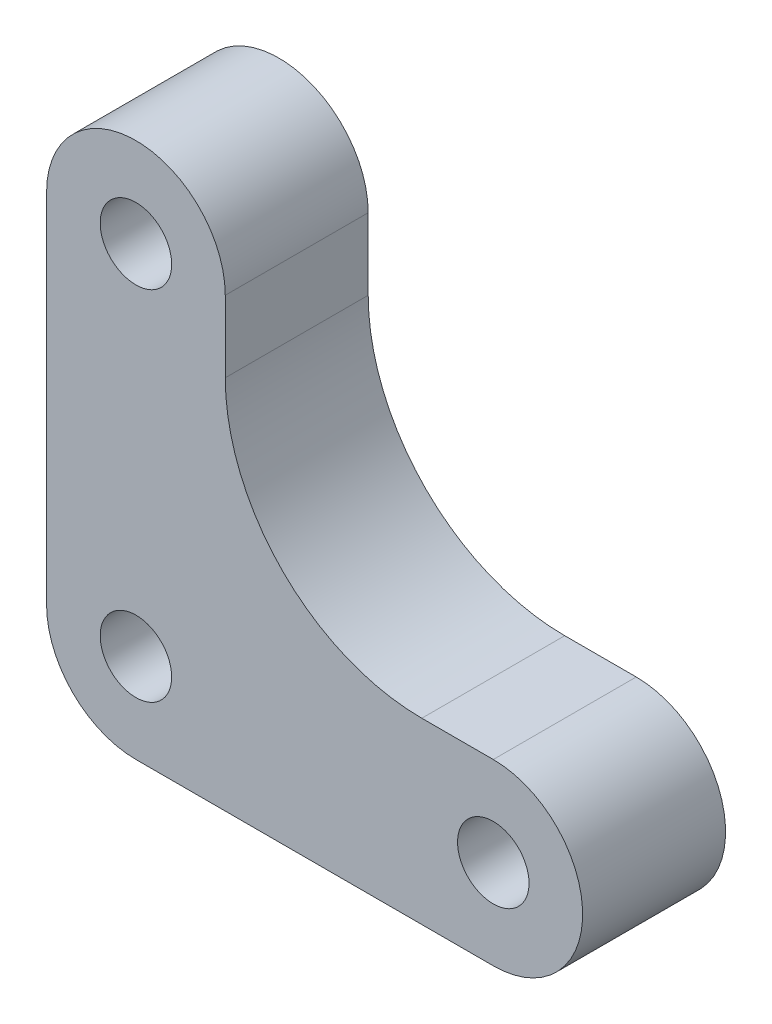
ISO-10303-21;
HEADER;
FILE_DESCRIPTION(('STEP AP214'),'2;1');
FILE_NAME('part.step','',(''),(''),'','','');
FILE_SCHEMA(('AUTOMOTIVE_DESIGN { 1 0 10303 214 1 1 1 1 }'));
ENDSEC;
DATA;
#1=APPLICATION_CONTEXT('core data for automotive mechanical design processes');
#2=APPLICATION_PROTOCOL_DEFINITION('international standard','automotive_design',2000,#1);
#3=PRODUCT_CONTEXT('',#1,'mechanical');
#4=PRODUCT('Part','Part','',(#3));
#5=PRODUCT_RELATED_PRODUCT_CATEGORY('part','',(#4));
#6=PRODUCT_DEFINITION_FORMATION('','',#4);
#7=PRODUCT_DEFINITION_CONTEXT('part definition',#1,'design');
#8=PRODUCT_DEFINITION('design','',#6,#7);
#9=PRODUCT_DEFINITION_SHAPE('','',#8);
#10=(LENGTH_UNIT() NAMED_UNIT(*) SI_UNIT(.MILLI.,.METRE.));
#11=(NAMED_UNIT(*) PLANE_ANGLE_UNIT() SI_UNIT($,.RADIAN.));
#12=(NAMED_UNIT(*) SI_UNIT($,.STERADIAN.) SOLID_ANGLE_UNIT());
#13=UNCERTAINTY_MEASURE_WITH_UNIT(LENGTH_MEASURE(1.E-05),#10,'distance_accuracy_value','');
#14=(GEOMETRIC_REPRESENTATION_CONTEXT(3) GLOBAL_UNCERTAINTY_ASSIGNED_CONTEXT((#13)) GLOBAL_UNIT_ASSIGNED_CONTEXT((#10,
#11,#12)) REPRESENTATION_CONTEXT('',''));
#15=CARTESIAN_POINT('',(0.,0.,0.));
#16=DIRECTION('',(0.,0.,1.));
#17=DIRECTION('',(1.,0.,0.));
#18=AXIS2_PLACEMENT_3D('',#15,#16,#17);
#19=CARTESIAN_POINT('',(-20.,20.,-5.));
#20=DIRECTION('',(0.,0.,-1.));
#21=DIRECTION('',(-1.,0.,0.));
#22=AXIS2_PLACEMENT_3D('',#19,#20,#21);
#23=CYLINDRICAL_SURFACE('',#22,5.);
#24=CARTESIAN_POINT('',(-20.,20.,-13.));
#25=DIRECTION('',(0.,0.,-1.));
#26=DIRECTION('',(-1.,0.,0.));
#27=AXIS2_PLACEMENT_3D('',#24,#25,#26);
#28=CIRCLE('',#27,5.);
#29=CARTESIAN_POINT('',(-25.,20.,-13.));
#30=VERTEX_POINT('',#29);
#31=CARTESIAN_POINT('',(-15.,20.,-13.));
#32=VERTEX_POINT('',#31);
#33=EDGE_CURVE('E205',#30,#32,#28,.T.);
#34=ORIENTED_EDGE('',*,*,#33,.F.);
#35=DIRECTION('',(0.,0.,-1.));
#36=VECTOR('',#35,1.);
#37=CARTESIAN_POINT('',(-25.,20.,-5.));
#38=LINE('',#37,#36);
#39=CARTESIAN_POINT('',(-25.,20.,-5.));
#40=VERTEX_POINT('',#39);
#41=EDGE_CURVE('E242',#40,#30,#38,.T.);
#42=ORIENTED_EDGE('',*,*,#41,.F.);
#43=CARTESIAN_POINT('',(-20.,20.,-5.));
#44=DIRECTION('',(0.,0.,-1.));
#45=DIRECTION('',(-1.,0.,0.));
#46=AXIS2_PLACEMENT_3D('',#43,#44,#45);
#47=CIRCLE('',#46,5.);
#48=CARTESIAN_POINT('',(-15.,20.,-5.));
#49=VERTEX_POINT('',#48);
#50=EDGE_CURVE('E210',#40,#49,#47,.T.);
#51=ORIENTED_EDGE('',*,*,#50,.T.);
#52=DIRECTION('',(0.,0.,-1.));
#53=VECTOR('',#52,1.);
#54=CARTESIAN_POINT('',(-15.,20.,-5.));
#55=LINE('',#54,#53);
#56=EDGE_CURVE('E227',#49,#32,#55,.T.);
#57=ORIENTED_EDGE('',*,*,#56,.T.);
#58=EDGE_LOOP('',(#34,#42,#51,#57));
#59=FACE_BOUND('',#58,.T.);
#60=ADVANCED_FACE('F39',(#59),#23,.T.);
#61=CARTESIAN_POINT('',(-25.,-5.,-5.));
#62=DIRECTION('',(-1.,0.,0.));
#63=DIRECTION('',(0.,0.,1.));
#64=AXIS2_PLACEMENT_3D('',#61,#62,#63);
#65=PLANE('',#64);
#66=DIRECTION('',(0.,1.,0.));
#67=VECTOR('',#66,1.);
#68=CARTESIAN_POINT('',(-25.,-5.,-13.));
#69=LINE('',#68,#67);
#70=CARTESIAN_POINT('',(-25.,0.,-13.));
#71=VERTEX_POINT('',#70);
#72=EDGE_CURVE('E214',#71,#30,#69,.T.);
#73=ORIENTED_EDGE('',*,*,#72,.F.);
#74=DIRECTION('',(0.,0.,-1.));
#75=VECTOR('',#74,1.);
#76=CARTESIAN_POINT('',(-25.,0.,-5.));
#77=LINE('',#76,#75);
#78=CARTESIAN_POINT('',(-25.,0.,-5.));
#79=VERTEX_POINT('',#78);
#80=EDGE_CURVE('E274',#71,#79,#77,.F.);
#81=ORIENTED_EDGE('',*,*,#80,.T.);
#82=DIRECTION('',(0.,1.,0.));
#83=VECTOR('',#82,1.);
#84=CARTESIAN_POINT('',(-25.,-5.,-5.));
#85=LINE('',#84,#83);
#86=EDGE_CURVE('E225',#79,#40,#85,.T.);
#87=ORIENTED_EDGE('',*,*,#86,.T.);
#88=ORIENTED_EDGE('',*,*,#41,.T.);
#89=EDGE_LOOP('',(#73,#81,#87,#88));
#90=FACE_BOUND('',#89,.T.);
#91=ADVANCED_FACE('F318',(#90),#65,.T.);
#92=CARTESIAN_POINT('',(0.,-5.,-5.));
#93=DIRECTION('',(0.,-1.,0.));
#94=DIRECTION('',(1.,0.,0.));
#95=AXIS2_PLACEMENT_3D('',#92,#93,#94);
#96=PLANE('',#95);
#97=DIRECTION('',(-1.,0.,0.));
#98=VECTOR('',#97,1.);
#99=CARTESIAN_POINT('',(0.,-5.,-5.));
#100=LINE('',#99,#98);
#101=CARTESIAN_POINT('',(0.,-5.,-5.));
#102=VERTEX_POINT('',#101);
#103=CARTESIAN_POINT('',(-20.,-5.,-5.));
#104=VERTEX_POINT('',#103);
#105=EDGE_CURVE('E222',#102,#104,#100,.T.);
#106=ORIENTED_EDGE('',*,*,#105,.T.);
#107=DIRECTION('',(0.,0.,-1.));
#108=VECTOR('',#107,1.);
#109=CARTESIAN_POINT('',(-20.,-5.,-5.));
#110=LINE('',#109,#108);
#111=CARTESIAN_POINT('',(-20.,-5.,-13.));
#112=VERTEX_POINT('',#111);
#113=EDGE_CURVE('E269',#104,#112,#110,.T.);
#114=ORIENTED_EDGE('',*,*,#113,.T.);
#115=DIRECTION('',(-1.,0.,0.));
#116=VECTOR('',#115,1.);
#117=CARTESIAN_POINT('',(0.,-5.,-13.));
#118=LINE('',#117,#116);
#119=CARTESIAN_POINT('',(0.,-5.,-13.));
#120=VERTEX_POINT('',#119);
#121=EDGE_CURVE('E238',#120,#112,#118,.T.);
#122=ORIENTED_EDGE('',*,*,#121,.F.);
#123=DIRECTION('',(0.,0.,-1.));
#124=VECTOR('',#123,1.);
#125=CARTESIAN_POINT('',(0.,-5.,-5.));
#126=LINE('',#125,#124);
#127=EDGE_CURVE('E246',#102,#120,#126,.T.);
#128=ORIENTED_EDGE('',*,*,#127,.F.);
#129=EDGE_LOOP('',(#106,#114,#122,#128));
#130=FACE_BOUND('',#129,.T.);
#131=ADVANCED_FACE('F325',(#130),#96,.T.);
#132=CARTESIAN_POINT('',(0.,0.,-5.));
#133=DIRECTION('',(0.,0.,-1.));
#134=DIRECTION('',(-1.,0.,0.));
#135=AXIS2_PLACEMENT_3D('',#132,#133,#134);
#136=CYLINDRICAL_SURFACE('',#135,5.);
#137=CARTESIAN_POINT('',(0.,0.,-13.));
#138=DIRECTION('',(0.,0.,-1.));
#139=DIRECTION('',(-1.,0.,0.));
#140=AXIS2_PLACEMENT_3D('',#137,#138,#139);
#141=CIRCLE('',#140,5.);
#142=CARTESIAN_POINT('',(0.,5.,-13.));
#143=VERTEX_POINT('',#142);
#144=EDGE_CURVE('E235',#143,#120,#141,.T.);
#145=ORIENTED_EDGE('',*,*,#144,.F.);
#146=DIRECTION('',(0.,0.,-1.));
#147=VECTOR('',#146,1.);
#148=CARTESIAN_POINT('',(0.,5.,-5.));
#149=LINE('',#148,#147);
#150=CARTESIAN_POINT('',(0.,5.,-5.));
#151=VERTEX_POINT('',#150);
#152=EDGE_CURVE('E248',#151,#143,#149,.T.);
#153=ORIENTED_EDGE('',*,*,#152,.F.);
#154=CARTESIAN_POINT('',(0.,0.,-5.));
#155=DIRECTION('',(0.,0.,-1.));
#156=DIRECTION('',(-1.,0.,0.));
#157=AXIS2_PLACEMENT_3D('',#154,#155,#156);
#158=CIRCLE('',#157,5.);
#159=EDGE_CURVE('E219',#151,#102,#158,.T.);
#160=ORIENTED_EDGE('',*,*,#159,.T.);
#161=ORIENTED_EDGE('',*,*,#127,.T.);
#162=EDGE_LOOP('',(#145,#153,#160,#161));
#163=FACE_BOUND('',#162,.T.);
#164=ADVANCED_FACE('F355',(#163),#136,.T.);
#165=CARTESIAN_POINT('',(-15.,5.,-5.));
#166=DIRECTION('',(0.,1.,0.));
#167=DIRECTION('',(-1.,0.,0.));
#168=AXIS2_PLACEMENT_3D('',#165,#166,#167);
#169=PLANE('',#168);
#170=DIRECTION('',(1.,0.,0.));
#171=VECTOR('',#170,1.);
#172=CARTESIAN_POINT('',(-15.,5.,-13.));
#173=LINE('',#172,#171);
#174=CARTESIAN_POINT('',(-4.,5.,-13.));
#175=VERTEX_POINT('',#174);
#176=EDGE_CURVE('E233',#175,#143,#173,.T.);
#177=ORIENTED_EDGE('',*,*,#176,.F.);
#178=DIRECTION('',(0.,0.,-1.));
#179=VECTOR('',#178,1.);
#180=CARTESIAN_POINT('',(-4.,5.,-5.));
#181=LINE('',#180,#179);
#182=CARTESIAN_POINT('',(-4.,5.,-5.));
#183=VERTEX_POINT('',#182);
#184=EDGE_CURVE('E281',#175,#183,#181,.F.);
#185=ORIENTED_EDGE('',*,*,#184,.T.);
#186=DIRECTION('',(1.,0.,0.));
#187=VECTOR('',#186,1.);
#188=CARTESIAN_POINT('',(-15.,5.,-5.));
#189=LINE('',#188,#187);
#190=EDGE_CURVE('E217',#183,#151,#189,.T.);
#191=ORIENTED_EDGE('',*,*,#190,.T.);
#192=ORIENTED_EDGE('',*,*,#152,.T.);
#193=EDGE_LOOP('',(#177,#185,#191,#192));
#194=FACE_BOUND('',#193,.T.);
#195=ADVANCED_FACE('F368',(#194),#169,.T.);
#196=CARTESIAN_POINT('',(-15.,20.,-5.));
#197=DIRECTION('',(1.,0.,0.));
#198=DIRECTION('',(0.,0.,-1.));
#199=AXIS2_PLACEMENT_3D('',#196,#197,#198);
#200=PLANE('',#199);
#201=DIRECTION('',(0.,-1.,0.));
#202=VECTOR('',#201,1.);
#203=CARTESIAN_POINT('',(-15.,20.,-5.));
#204=LINE('',#203,#202);
#205=CARTESIAN_POINT('',(-15.,16.,-5.));
#206=VERTEX_POINT('',#205);
#207=EDGE_CURVE('E213',#49,#206,#204,.T.);
#208=ORIENTED_EDGE('',*,*,#207,.T.);
#209=DIRECTION('',(0.,0.,-1.));
#210=VECTOR('',#209,1.);
#211=CARTESIAN_POINT('',(-15.,16.,-13.));
#212=LINE('',#211,#210);
#213=CARTESIAN_POINT('',(-15.,16.,-13.));
#214=VERTEX_POINT('',#213);
#215=EDGE_CURVE('E278',#206,#214,#212,.T.);
#216=ORIENTED_EDGE('',*,*,#215,.T.);
#217=DIRECTION('',(0.,-1.,0.));
#218=VECTOR('',#217,1.);
#219=CARTESIAN_POINT('',(-15.,20.,-13.));
#220=LINE('',#219,#218);
#221=EDGE_CURVE('E230',#32,#214,#220,.T.);
#222=ORIENTED_EDGE('',*,*,#221,.F.);
#223=ORIENTED_EDGE('',*,*,#56,.F.);
#224=EDGE_LOOP('',(#208,#216,#222,#223));
#225=FACE_BOUND('',#224,.T.);
#226=ADVANCED_FACE('F331',(#225),#200,.T.);
#227=CARTESIAN_POINT('',(-20.,20.,-5.));
#228=DIRECTION('',(0.,0.,-1.));
#229=DIRECTION('',(-1.,0.,0.));
#230=AXIS2_PLACEMENT_3D('',#227,#228,#229);
#231=PLANE('',#230);
#232=CARTESIAN_POINT('',(-20.,0.,-5.));
#233=DIRECTION('',(0.,0.,1.));
#234=DIRECTION('',(1.,0.,0.));
#235=AXIS2_PLACEMENT_3D('',#232,#233,#234);
#236=CIRCLE('',#235,1.99999999999999);
#237=CARTESIAN_POINT('',(-18.,0.,-5.));
#238=VERTEX_POINT('',#237);
#239=EDGE_CURVE('E261',#238,#238,#236,.T.);
#240=ORIENTED_EDGE('',*,*,#239,.F.);
#241=EDGE_LOOP('',(#240));
#242=FACE_BOUND('',#241,.T.);
#243=CARTESIAN_POINT('',(-20.,20.,-5.));
#244=DIRECTION('',(0.,0.,1.));
#245=DIRECTION('',(1.,0.,0.));
#246=AXIS2_PLACEMENT_3D('',#243,#244,#245);
#247=CIRCLE('',#246,1.99999999999999);
#248=CARTESIAN_POINT('',(-18.,20.,-5.));
#249=VERTEX_POINT('',#248);
#250=EDGE_CURVE('E257',#249,#249,#247,.T.);
#251=ORIENTED_EDGE('',*,*,#250,.F.);
#252=EDGE_LOOP('',(#251));
#253=FACE_BOUND('',#252,.T.);
#254=CARTESIAN_POINT('',(0.,0.,-5.));
#255=DIRECTION('',(0.,0.,1.));
#256=DIRECTION('',(1.,0.,0.));
#257=AXIS2_PLACEMENT_3D('',#254,#255,#256);
#258=CIRCLE('',#257,1.99999999999999);
#259=CARTESIAN_POINT('',(1.99999999999999,0.,-5.));
#260=VERTEX_POINT('',#259);
#261=EDGE_CURVE('E183',#260,#260,#258,.T.);
#262=ORIENTED_EDGE('',*,*,#261,.F.);
#263=EDGE_LOOP('',(#262));
#264=FACE_BOUND('',#263,.T.);
#265=ORIENTED_EDGE('',*,*,#86,.F.);
#266=CARTESIAN_POINT('',(-20.,0.,-5.));
#267=DIRECTION('',(0.,0.,-1.));
#268=DIRECTION('',(-1.,0.,0.));
#269=AXIS2_PLACEMENT_3D('',#266,#267,#268);
#270=CIRCLE('',#269,5.);
#271=EDGE_CURVE('E276',#79,#104,#270,.F.);
#272=ORIENTED_EDGE('',*,*,#271,.T.);
#273=ORIENTED_EDGE('',*,*,#105,.F.);
#274=ORIENTED_EDGE('',*,*,#159,.F.);
#275=ORIENTED_EDGE('',*,*,#190,.F.);
#276=CARTESIAN_POINT('',(-4.,16.,-5.));
#277=DIRECTION('',(0.,0.,-1.));
#278=DIRECTION('',(-1.,0.,0.));
#279=AXIS2_PLACEMENT_3D('',#276,#277,#278);
#280=CIRCLE('',#279,11.);
#281=EDGE_CURVE('E285',#183,#206,#280,.T.);
#282=ORIENTED_EDGE('',*,*,#281,.T.);
#283=ORIENTED_EDGE('',*,*,#207,.F.);
#284=ORIENTED_EDGE('',*,*,#50,.F.);
#285=EDGE_LOOP('',(#265,#272,#273,#274,#275,#282,#283,#284));
#286=FACE_BOUND('',#285,.T.);
#287=ADVANCED_FACE('F348',(#242,#253,#264,#286),#231,.F.);
#288=CARTESIAN_POINT('',(-20.,20.,-13.));
#289=DIRECTION('',(0.,0.,-1.));
#290=DIRECTION('',(-1.,0.,0.));
#291=AXIS2_PLACEMENT_3D('',#288,#289,#290);
#292=PLANE('',#291);
#293=DIRECTION('',(1.,0.,0.));
#294=VECTOR('',#293,1.);
#295=CARTESIAN_POINT('',(-17.,3.,-13.));
#296=LINE('',#295,#294);
#297=CARTESIAN_POINT('',(-4.,3.,-13.));
#298=VERTEX_POINT('',#297);
#299=CARTESIAN_POINT('',(0.,3.,-13.));
#300=VERTEX_POINT('',#299);
#301=EDGE_CURVE('E178',#298,#300,#296,.T.);
#302=ORIENTED_EDGE('',*,*,#301,.F.);
#303=CARTESIAN_POINT('',(-4.,16.,-13.));
#304=DIRECTION('',(0.,0.,-1.));
#305=DIRECTION('',(-1.,0.,0.));
#306=AXIS2_PLACEMENT_3D('',#303,#304,#305);
#307=CIRCLE('',#306,13.);
#308=CARTESIAN_POINT('',(-17.,16.,-13.));
#309=VERTEX_POINT('',#308);
#310=EDGE_CURVE('E61',#298,#309,#307,.T.);
#311=ORIENTED_EDGE('',*,*,#310,.T.);
#312=DIRECTION('',(0.,-1.,0.));
#313=VECTOR('',#312,1.);
#314=CARTESIAN_POINT('',(-17.,20.,-13.));
#315=LINE('',#314,#313);
#316=CARTESIAN_POINT('',(-17.,20.,-13.));
#317=VERTEX_POINT('',#316);
#318=EDGE_CURVE('E180',#317,#309,#315,.T.);
#319=ORIENTED_EDGE('',*,*,#318,.F.);
#320=CARTESIAN_POINT('',(-20.,20.,-13.));
#321=DIRECTION('',(0.,0.,-1.));
#322=DIRECTION('',(-1.,0.,0.));
#323=AXIS2_PLACEMENT_3D('',#320,#321,#322);
#324=CIRCLE('',#323,3.);
#325=CARTESIAN_POINT('',(-23.,20.,-13.));
#326=VERTEX_POINT('',#325);
#327=EDGE_CURVE('E199',#326,#317,#324,.T.);
#328=ORIENTED_EDGE('',*,*,#327,.F.);
#329=DIRECTION('',(0.,1.,0.));
#330=VECTOR('',#329,1.);
#331=CARTESIAN_POINT('',(-23.,-3.,-13.));
#332=LINE('',#331,#330);
#333=CARTESIAN_POINT('',(-23.,0.,-13.));
#334=VERTEX_POINT('',#333);
#335=EDGE_CURVE('E197',#334,#326,#332,.T.);
#336=ORIENTED_EDGE('',*,*,#335,.F.);
#337=CARTESIAN_POINT('',(-20.,0.,-13.));
#338=DIRECTION('',(0.,0.,-1.));
#339=DIRECTION('',(-1.,0.,0.));
#340=AXIS2_PLACEMENT_3D('',#337,#338,#339);
#341=CIRCLE('',#340,3.);
#342=CARTESIAN_POINT('',(-20.,-3.,-13.));
#343=VERTEX_POINT('',#342);
#344=EDGE_CURVE('E267',#334,#343,#341,.F.);
#345=ORIENTED_EDGE('',*,*,#344,.T.);
#346=DIRECTION('',(-1.,0.,0.));
#347=VECTOR('',#346,1.);
#348=CARTESIAN_POINT('',(0.,-3.,-13.));
#349=LINE('',#348,#347);
#350=CARTESIAN_POINT('',(0.,-3.,-13.));
#351=VERTEX_POINT('',#350);
#352=EDGE_CURVE('E194',#351,#343,#349,.T.);
#353=ORIENTED_EDGE('',*,*,#352,.F.);
#354=CARTESIAN_POINT('',(0.,0.,-13.));
#355=DIRECTION('',(0.,0.,-1.));
#356=DIRECTION('',(-1.,0.,0.));
#357=AXIS2_PLACEMENT_3D('',#354,#355,#356);
#358=CIRCLE('',#357,3.);
#359=EDGE_CURVE('E159',#300,#351,#358,.T.);
#360=ORIENTED_EDGE('',*,*,#359,.F.);
#361=EDGE_LOOP('',(#302,#311,#319,#328,#336,#345,#353,#360));
#362=FACE_BOUND('',#361,.T.);
#363=ORIENTED_EDGE('',*,*,#121,.T.);
#364=CARTESIAN_POINT('',(-20.,0.,-13.));
#365=DIRECTION('',(0.,0.,-1.));
#366=DIRECTION('',(-1.,0.,0.));
#367=AXIS2_PLACEMENT_3D('',#364,#365,#366);
#368=CIRCLE('',#367,5.);
#369=EDGE_CURVE('E272',#112,#71,#368,.T.);
#370=ORIENTED_EDGE('',*,*,#369,.T.);
#371=ORIENTED_EDGE('',*,*,#72,.T.);
#372=ORIENTED_EDGE('',*,*,#33,.T.);
#373=ORIENTED_EDGE('',*,*,#221,.T.);
#374=CARTESIAN_POINT('',(-4.,16.,-13.));
#375=DIRECTION('',(0.,0.,-1.));
#376=DIRECTION('',(-1.,0.,0.));
#377=AXIS2_PLACEMENT_3D('',#374,#375,#376);
#378=CIRCLE('',#377,11.);
#379=EDGE_CURVE('E283',#214,#175,#378,.F.);
#380=ORIENTED_EDGE('',*,*,#379,.T.);
#381=ORIENTED_EDGE('',*,*,#176,.T.);
#382=ORIENTED_EDGE('',*,*,#144,.T.);
#383=EDGE_LOOP('',(#363,#370,#371,#372,#373,#380,#381,#382));
#384=FACE_BOUND('',#383,.T.);
#385=ADVANCED_FACE('F295',(#362,#384),#292,.T.);
#386=CARTESIAN_POINT('',(0.,0.,-10.));
#387=DIRECTION('',(0.,0.,-1.));
#388=DIRECTION('',(-1.,0.,0.));
#389=AXIS2_PLACEMENT_3D('',#386,#387,#388);
#390=CYLINDRICAL_SURFACE('',#389,3.);
#391=ORIENTED_EDGE('',*,*,#359,.T.);
#392=DIRECTION('',(0.,0.,-1.));
#393=VECTOR('',#392,1.);
#394=CARTESIAN_POINT('',(0.,-3.,-10.));
#395=LINE('',#394,#393);
#396=CARTESIAN_POINT('',(0.,-3.,-10.));
#397=VERTEX_POINT('',#396);
#398=EDGE_CURVE('E152',#397,#351,#395,.T.);
#399=ORIENTED_EDGE('',*,*,#398,.F.);
#400=CARTESIAN_POINT('',(0.,0.,-10.));
#401=DIRECTION('',(0.,0.,-1.));
#402=DIRECTION('',(-1.,0.,0.));
#403=AXIS2_PLACEMENT_3D('',#400,#401,#402);
#404=CIRCLE('',#403,3.);
#405=CARTESIAN_POINT('',(0.,3.,-10.));
#406=VERTEX_POINT('',#405);
#407=EDGE_CURVE('E157',#406,#397,#404,.T.);
#408=ORIENTED_EDGE('',*,*,#407,.F.);
#409=DIRECTION('',(0.,0.,-1.));
#410=VECTOR('',#409,1.);
#411=CARTESIAN_POINT('',(0.,3.,-10.));
#412=LINE('',#411,#410);
#413=EDGE_CURVE('E203',#406,#300,#412,.T.);
#414=ORIENTED_EDGE('',*,*,#413,.T.);
#415=EDGE_LOOP('',(#391,#399,#408,#414));
#416=FACE_BOUND('',#415,.T.);
#417=ADVANCED_FACE('F154',(#416),#390,.F.);
#418=CARTESIAN_POINT('',(-17.,3.,-10.));
#419=DIRECTION('',(0.,1.,0.));
#420=DIRECTION('',(-1.,0.,0.));
#421=AXIS2_PLACEMENT_3D('',#418,#419,#420);
#422=PLANE('',#421);
#423=DIRECTION('',(1.,0.,0.));
#424=VECTOR('',#423,1.);
#425=CARTESIAN_POINT('',(-17.,3.,-10.));
#426=LINE('',#425,#424);
#427=CARTESIAN_POINT('',(-4.,3.,-10.));
#428=VERTEX_POINT('',#427);
#429=EDGE_CURVE('E164',#428,#406,#426,.T.);
#430=ORIENTED_EDGE('',*,*,#429,.F.);
#431=DIRECTION('',(0.,0.,-1.));
#432=VECTOR('',#431,1.);
#433=CARTESIAN_POINT('',(-4.,3.,-10.));
#434=LINE('',#433,#432);
#435=EDGE_CURVE('E287',#428,#298,#434,.T.);
#436=ORIENTED_EDGE('',*,*,#435,.T.);
#437=ORIENTED_EDGE('',*,*,#301,.T.);
#438=ORIENTED_EDGE('',*,*,#413,.F.);
#439=EDGE_LOOP('',(#430,#436,#437,#438));
#440=FACE_BOUND('',#439,.T.);
#441=ADVANCED_FACE('F292',(#440),#422,.F.);
#442=CARTESIAN_POINT('',(-17.,20.,-10.));
#443=DIRECTION('',(1.,0.,0.));
#444=DIRECTION('',(0.,0.,-1.));
#445=AXIS2_PLACEMENT_3D('',#442,#443,#444);
#446=PLANE('',#445);
#447=ORIENTED_EDGE('',*,*,#318,.T.);
#448=DIRECTION('',(0.,0.,-1.));
#449=VECTOR('',#448,1.);
#450=CARTESIAN_POINT('',(-17.,16.,-10.));
#451=LINE('',#450,#449);
#452=CARTESIAN_POINT('',(-17.,16.,-10.));
#453=VERTEX_POINT('',#452);
#454=EDGE_CURVE('E47',#309,#453,#451,.F.);
#455=ORIENTED_EDGE('',*,*,#454,.T.);
#456=DIRECTION('',(0.,-1.,0.));
#457=VECTOR('',#456,1.);
#458=CARTESIAN_POINT('',(-17.,20.,-10.));
#459=LINE('',#458,#457);
#460=CARTESIAN_POINT('',(-17.,20.,-10.));
#461=VERTEX_POINT('',#460);
#462=EDGE_CURVE('E190',#461,#453,#459,.T.);
#463=ORIENTED_EDGE('',*,*,#462,.F.);
#464=DIRECTION('',(0.,0.,-1.));
#465=VECTOR('',#464,1.);
#466=CARTESIAN_POINT('',(-17.,20.,-10.));
#467=LINE('',#466,#465);
#468=EDGE_CURVE('E206',#461,#317,#467,.T.);
#469=ORIENTED_EDGE('',*,*,#468,.T.);
#470=EDGE_LOOP('',(#447,#455,#463,#469));
#471=FACE_BOUND('',#470,.T.);
#472=ADVANCED_FACE('F388',(#471),#446,.F.);
#473=CARTESIAN_POINT('',(-20.,20.,-10.));
#474=DIRECTION('',(0.,0.,-1.));
#475=DIRECTION('',(-1.,0.,0.));
#476=AXIS2_PLACEMENT_3D('',#473,#474,#475);
#477=CYLINDRICAL_SURFACE('',#476,3.);
#478=ORIENTED_EDGE('',*,*,#327,.T.);
#479=ORIENTED_EDGE('',*,*,#468,.F.);
#480=CARTESIAN_POINT('',(-20.,20.,-10.));
#481=DIRECTION('',(0.,0.,-1.));
#482=DIRECTION('',(-1.,0.,0.));
#483=AXIS2_PLACEMENT_3D('',#480,#481,#482);
#484=CIRCLE('',#483,3.);
#485=CARTESIAN_POINT('',(-23.,20.,-10.));
#486=VERTEX_POINT('',#485);
#487=EDGE_CURVE('E187',#486,#461,#484,.T.);
#488=ORIENTED_EDGE('',*,*,#487,.F.);
#489=DIRECTION('',(0.,0.,-1.));
#490=VECTOR('',#489,1.);
#491=CARTESIAN_POINT('',(-23.,20.,-10.));
#492=LINE('',#491,#490);
#493=EDGE_CURVE('E163',#486,#326,#492,.T.);
#494=ORIENTED_EDGE('',*,*,#493,.T.);
#495=EDGE_LOOP('',(#478,#479,#488,#494));
#496=FACE_BOUND('',#495,.T.);
#497=ADVANCED_FACE('F308',(#496),#477,.F.);
#498=CARTESIAN_POINT('',(-23.,-3.,-10.));
#499=DIRECTION('',(-1.,0.,0.));
#500=DIRECTION('',(0.,0.,1.));
#501=AXIS2_PLACEMENT_3D('',#498,#499,#500);
#502=PLANE('',#501);
#503=DIRECTION('',(0.,1.,0.));
#504=VECTOR('',#503,1.);
#505=CARTESIAN_POINT('',(-23.,-3.,-10.));
#506=LINE('',#505,#504);
#507=CARTESIAN_POINT('',(-23.,0.,-10.));
#508=VERTEX_POINT('',#507);
#509=EDGE_CURVE('E173',#508,#486,#506,.T.);
#510=ORIENTED_EDGE('',*,*,#509,.F.);
#511=DIRECTION('',(0.,0.,-1.));
#512=VECTOR('',#511,1.);
#513=CARTESIAN_POINT('',(-23.,0.,-13.));
#514=LINE('',#513,#512);
#515=EDGE_CURVE('E245',#508,#334,#514,.T.);
#516=ORIENTED_EDGE('',*,*,#515,.T.);
#517=ORIENTED_EDGE('',*,*,#335,.T.);
#518=ORIENTED_EDGE('',*,*,#493,.F.);
#519=EDGE_LOOP('',(#510,#516,#517,#518));
#520=FACE_BOUND('',#519,.T.);
#521=ADVANCED_FACE('F304',(#520),#502,.F.);
#522=CARTESIAN_POINT('',(0.,-3.,-10.));
#523=DIRECTION('',(0.,-1.,0.));
#524=DIRECTION('',(1.,0.,0.));
#525=AXIS2_PLACEMENT_3D('',#522,#523,#524);
#526=PLANE('',#525);
#527=ORIENTED_EDGE('',*,*,#352,.T.);
#528=DIRECTION('',(0.,0.,-1.));
#529=VECTOR('',#528,1.);
#530=CARTESIAN_POINT('',(-20.,-3.,-10.));
#531=LINE('',#530,#529);
#532=CARTESIAN_POINT('',(-20.,-3.,-10.));
#533=VERTEX_POINT('',#532);
#534=EDGE_CURVE('E170',#343,#533,#531,.F.);
#535=ORIENTED_EDGE('',*,*,#534,.T.);
#536=DIRECTION('',(-1.,0.,0.));
#537=VECTOR('',#536,1.);
#538=CARTESIAN_POINT('',(0.,-3.,-10.));
#539=LINE('',#538,#537);
#540=EDGE_CURVE('E167',#397,#533,#539,.T.);
#541=ORIENTED_EDGE('',*,*,#540,.F.);
#542=ORIENTED_EDGE('',*,*,#398,.T.);
#543=EDGE_LOOP('',(#527,#535,#541,#542));
#544=FACE_BOUND('',#543,.T.);
#545=ADVANCED_FACE('F168',(#544),#526,.F.);
#546=CARTESIAN_POINT('',(0.,0.,-10.));
#547=DIRECTION('',(0.,0.,-1.));
#548=DIRECTION('',(-1.,0.,0.));
#549=AXIS2_PLACEMENT_3D('',#546,#547,#548);
#550=PLANE('',#549);
#551=CARTESIAN_POINT('',(-20.,0.,-10.));
#552=DIRECTION('',(0.,0.,-1.));
#553=DIRECTION('',(-1.,0.,0.));
#554=AXIS2_PLACEMENT_3D('',#551,#552,#553);
#555=CIRCLE('',#554,1.99999999999999);
#556=CARTESIAN_POINT('',(-22.,0.,-10.));
#557=VERTEX_POINT('',#556);
#558=EDGE_CURVE('E258',#557,#557,#555,.T.);
#559=ORIENTED_EDGE('',*,*,#558,.F.);
#560=EDGE_LOOP('',(#559));
#561=FACE_BOUND('',#560,.T.);
#562=CARTESIAN_POINT('',(-20.,20.,-10.));
#563=DIRECTION('',(0.,0.,-1.));
#564=DIRECTION('',(-1.,0.,0.));
#565=AXIS2_PLACEMENT_3D('',#562,#563,#564);
#566=CIRCLE('',#565,1.99999999999999);
#567=CARTESIAN_POINT('',(-22.,20.,-10.));
#568=VERTEX_POINT('',#567);
#569=EDGE_CURVE('E254',#568,#568,#566,.T.);
#570=ORIENTED_EDGE('',*,*,#569,.F.);
#571=EDGE_LOOP('',(#570));
#572=FACE_BOUND('',#571,.T.);
#573=CARTESIAN_POINT('',(0.,0.,-10.));
#574=DIRECTION('',(0.,0.,-1.));
#575=DIRECTION('',(-1.,0.,0.));
#576=AXIS2_PLACEMENT_3D('',#573,#574,#575);
#577=CIRCLE('',#576,1.99999999999999);
#578=CARTESIAN_POINT('',(-1.99999999999999,0.,-10.));
#579=VERTEX_POINT('',#578);
#580=EDGE_CURVE('E195',#579,#579,#577,.T.);
#581=ORIENTED_EDGE('',*,*,#580,.F.);
#582=EDGE_LOOP('',(#581));
#583=FACE_BOUND('',#582,.T.);
#584=ORIENTED_EDGE('',*,*,#540,.T.);
#585=CARTESIAN_POINT('',(-20.,0.,-10.));
#586=DIRECTION('',(0.,0.,-1.));
#587=DIRECTION('',(-1.,0.,0.));
#588=AXIS2_PLACEMENT_3D('',#585,#586,#587);
#589=CIRCLE('',#588,3.);
#590=EDGE_CURVE('E265',#533,#508,#589,.T.);
#591=ORIENTED_EDGE('',*,*,#590,.T.);
#592=ORIENTED_EDGE('',*,*,#509,.T.);
#593=ORIENTED_EDGE('',*,*,#487,.T.);
#594=ORIENTED_EDGE('',*,*,#462,.T.);
#595=CARTESIAN_POINT('',(-4.,16.,-10.));
#596=DIRECTION('',(0.,0.,-1.));
#597=DIRECTION('',(-1.,0.,0.));
#598=AXIS2_PLACEMENT_3D('',#595,#596,#597);
#599=CIRCLE('',#598,13.);
#600=EDGE_CURVE('E11',#453,#428,#599,.F.);
#601=ORIENTED_EDGE('',*,*,#600,.T.);
#602=ORIENTED_EDGE('',*,*,#429,.T.);
#603=ORIENTED_EDGE('',*,*,#407,.T.);
#604=EDGE_LOOP('',(#584,#591,#592,#593,#594,#601,#602,#603));
#605=FACE_BOUND('',#604,.T.);
#606=ADVANCED_FACE('F175',(#561,#572,#583,#605),#550,.T.);
#607=CARTESIAN_POINT('',(0.,0.,-5.));
#608=DIRECTION('',(0.,0.,1.));
#609=DIRECTION('',(1.,0.,0.));
#610=AXIS2_PLACEMENT_3D('',#607,#608,#609);
#611=CYLINDRICAL_SURFACE('',#610,1.99999999999999);
#612=ORIENTED_EDGE('',*,*,#580,.T.);
#613=EDGE_LOOP('',(#612));
#614=FACE_BOUND('',#613,.T.);
#615=ORIENTED_EDGE('',*,*,#261,.T.);
#616=EDGE_LOOP('',(#615));
#617=FACE_BOUND('',#616,.T.);
#618=ADVANCED_FACE('F394',(#614,#617),#611,.F.);
#619=CARTESIAN_POINT('',(-20.,20.,-5.));
#620=DIRECTION('',(0.,0.,1.));
#621=DIRECTION('',(1.,0.,0.));
#622=AXIS2_PLACEMENT_3D('',#619,#620,#621);
#623=CYLINDRICAL_SURFACE('',#622,1.99999999999999);
#624=ORIENTED_EDGE('',*,*,#569,.T.);
#625=EDGE_LOOP('',(#624));
#626=FACE_BOUND('',#625,.T.);
#627=ORIENTED_EDGE('',*,*,#250,.T.);
#628=EDGE_LOOP('',(#627));
#629=FACE_BOUND('',#628,.T.);
#630=ADVANCED_FACE('F398',(#626,#629),#623,.F.);
#631=CARTESIAN_POINT('',(-20.,0.,-5.));
#632=DIRECTION('',(0.,0.,1.));
#633=DIRECTION('',(1.,0.,0.));
#634=AXIS2_PLACEMENT_3D('',#631,#632,#633);
#635=CYLINDRICAL_SURFACE('',#634,1.99999999999999);
#636=ORIENTED_EDGE('',*,*,#558,.T.);
#637=EDGE_LOOP('',(#636));
#638=FACE_BOUND('',#637,.T.);
#639=ORIENTED_EDGE('',*,*,#239,.T.);
#640=EDGE_LOOP('',(#639));
#641=FACE_BOUND('',#640,.T.);
#642=ADVANCED_FACE('F335',(#638,#641),#635,.F.);
#643=CARTESIAN_POINT('',(-20.,0.,-10.));
#644=DIRECTION('',(0.,0.,1.));
#645=DIRECTION('',(1.,0.,0.));
#646=AXIS2_PLACEMENT_3D('',#643,#644,#645);
#647=CYLINDRICAL_SURFACE('',#646,3.);
#648=ORIENTED_EDGE('',*,*,#590,.F.);
#649=ORIENTED_EDGE('',*,*,#534,.F.);
#650=ORIENTED_EDGE('',*,*,#344,.F.);
#651=ORIENTED_EDGE('',*,*,#515,.F.);
#652=EDGE_LOOP('',(#648,#649,#650,#651));
#653=FACE_BOUND('',#652,.T.);
#654=ADVANCED_FACE('F299',(#653),#647,.F.);
#655=CARTESIAN_POINT('',(-20.,0.,-5.));
#656=DIRECTION('',(0.,0.,-1.));
#657=DIRECTION('',(-1.,0.,0.));
#658=AXIS2_PLACEMENT_3D('',#655,#656,#657);
#659=CYLINDRICAL_SURFACE('',#658,5.);
#660=ORIENTED_EDGE('',*,*,#271,.F.);
#661=ORIENTED_EDGE('',*,*,#80,.F.);
#662=ORIENTED_EDGE('',*,*,#369,.F.);
#663=ORIENTED_EDGE('',*,*,#113,.F.);
#664=EDGE_LOOP('',(#660,#661,#662,#663));
#665=FACE_BOUND('',#664,.T.);
#666=ADVANCED_FACE('F315',(#665),#659,.T.);
#667=CARTESIAN_POINT('',(-4.,16.,-5.));
#668=DIRECTION('',(0.,0.,1.));
#669=DIRECTION('',(1.,0.,0.));
#670=AXIS2_PLACEMENT_3D('',#667,#668,#669);
#671=CYLINDRICAL_SURFACE('',#670,11.);
#672=ORIENTED_EDGE('',*,*,#281,.F.);
#673=ORIENTED_EDGE('',*,*,#184,.F.);
#674=ORIENTED_EDGE('',*,*,#379,.F.);
#675=ORIENTED_EDGE('',*,*,#215,.F.);
#676=EDGE_LOOP('',(#672,#673,#674,#675));
#677=FACE_BOUND('',#676,.T.);
#678=ADVANCED_FACE('F310',(#677),#671,.F.);
#679=CARTESIAN_POINT('',(-4.,16.,-10.));
#680=DIRECTION('',(0.,0.,-1.));
#681=DIRECTION('',(-1.,0.,0.));
#682=AXIS2_PLACEMENT_3D('',#679,#680,#681);
#683=CYLINDRICAL_SURFACE('',#682,13.);
#684=ORIENTED_EDGE('',*,*,#600,.F.);
#685=ORIENTED_EDGE('',*,*,#454,.F.);
#686=ORIENTED_EDGE('',*,*,#310,.F.);
#687=ORIENTED_EDGE('',*,*,#435,.F.);
#688=EDGE_LOOP('',(#684,#685,#686,#687));
#689=FACE_BOUND('',#688,.T.);
#690=ADVANCED_FACE('F41',(#689),#683,.T.);
#691=CLOSED_SHELL('',(#60,#91,#131,#164,#195,#226,#287,#385,#417,#441,#472,#497,#521,#545,#606,
#618,#630,#642,#654,#666,#678,#690));
#692=MANIFOLD_SOLID_BREP('B2',#691);
#693=ADVANCED_BREP_SHAPE_REPRESENTATION('',(#18,#692),#14);
#694=SHAPE_DEFINITION_REPRESENTATION(#9,#693);
ENDSEC;
END-ISO-10303-21;
